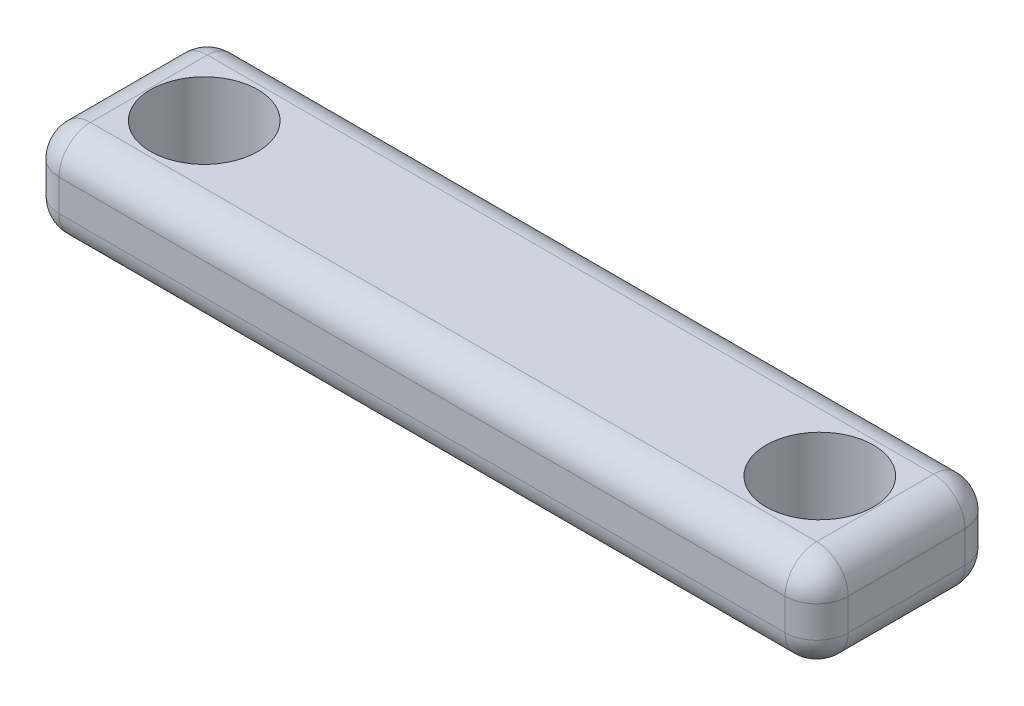
ISO-10303-21;
HEADER;
FILE_DESCRIPTION(('STEP AP214'),'2;1');
FILE_NAME('part.step','',(''),(''),'','','');
FILE_SCHEMA(('AUTOMOTIVE_DESIGN { 1 0 10303 214 1 1 1 1 }'));
ENDSEC;
DATA;
#1=APPLICATION_CONTEXT('core data for automotive mechanical design processes');
#2=APPLICATION_PROTOCOL_DEFINITION('international standard','automotive_design',2000,#1);
#3=PRODUCT_CONTEXT('',#1,'mechanical');
#4=PRODUCT('Part','Part','',(#3));
#5=PRODUCT_RELATED_PRODUCT_CATEGORY('part','',(#4));
#6=PRODUCT_DEFINITION_FORMATION('','',#4);
#7=PRODUCT_DEFINITION_CONTEXT('part definition',#1,'design');
#8=PRODUCT_DEFINITION('design','',#6,#7);
#9=PRODUCT_DEFINITION_SHAPE('','',#8);
#10=(LENGTH_UNIT() NAMED_UNIT(*) SI_UNIT(.MILLI.,.METRE.));
#11=(NAMED_UNIT(*) PLANE_ANGLE_UNIT() SI_UNIT($,.RADIAN.));
#12=(NAMED_UNIT(*) SI_UNIT($,.STERADIAN.) SOLID_ANGLE_UNIT());
#13=UNCERTAINTY_MEASURE_WITH_UNIT(LENGTH_MEASURE(1.E-05),#10,'distance_accuracy_value','');
#14=(GEOMETRIC_REPRESENTATION_CONTEXT(3) GLOBAL_UNCERTAINTY_ASSIGNED_CONTEXT((#13)) GLOBAL_UNIT_ASSIGNED_CONTEXT((#10,
#11,#12)) REPRESENTATION_CONTEXT('',''));
#15=CARTESIAN_POINT('',(0.,0.,0.));
#16=DIRECTION('',(0.,0.,1.));
#17=DIRECTION('',(1.,0.,0.));
#18=AXIS2_PLACEMENT_3D('',#15,#16,#17);
#19=CARTESIAN_POINT('',(0.,3.,0.));
#20=DIRECTION('',(0.,-1.,0.));
#21=DIRECTION('',(0.,0.,-1.));
#22=AXIS2_PLACEMENT_3D('',#19,#20,#21);
#23=PLANE('',#22);
#24=DIRECTION('',(0.,0.,-1.));
#25=VECTOR('',#24,1.);
#26=CARTESIAN_POINT('',(24.,3.,0.));
#27=LINE('',#26,#25);
#28=CARTESIAN_POINT('',(24.,3.,-1.));
#29=VERTEX_POINT('',#28);
#30=CARTESIAN_POINT('',(24.,3.,-4.7));
#31=VERTEX_POINT('',#30);
#32=EDGE_CURVE('E144',#29,#31,#27,.T.);
#33=ORIENTED_EDGE('',*,*,#32,.T.);
#34=DIRECTION('',(-1.,0.,0.));
#35=VECTOR('',#34,1.);
#36=CARTESIAN_POINT('',(0.,3.,-4.7));
#37=LINE('',#36,#35);
#38=CARTESIAN_POINT('',(1.,3.,-4.7));
#39=VERTEX_POINT('',#38);
#40=EDGE_CURVE('E139',#31,#39,#37,.T.);
#41=ORIENTED_EDGE('',*,*,#40,.T.);
#42=DIRECTION('',(0.,0.,1.));
#43=VECTOR('',#42,1.);
#44=CARTESIAN_POINT('',(1.,3.,0.));
#45=LINE('',#44,#43);
#46=CARTESIAN_POINT('',(1.,3.,-1.));
#47=VERTEX_POINT('',#46);
#48=EDGE_CURVE('E131',#39,#47,#45,.T.);
#49=ORIENTED_EDGE('',*,*,#48,.T.);
#50=DIRECTION('',(1.,0.,0.));
#51=VECTOR('',#50,1.);
#52=CARTESIAN_POINT('',(0.,3.,-1.));
#53=LINE('',#52,#51);
#54=EDGE_CURVE('E136',#47,#29,#53,.T.);
#55=ORIENTED_EDGE('',*,*,#54,.T.);
#56=EDGE_LOOP('',(#33,#41,#49,#55));
#57=FACE_BOUND('',#56,.T.);
#58=CARTESIAN_POINT('',(2.75,3.,-2.85));
#59=DIRECTION('',(0.,1.,0.));
#60=DIRECTION('',(0.,0.,1.));
#61=AXIS2_PLACEMENT_3D('',#58,#59,#60);
#62=CIRCLE('',#61,1.7);
#63=CARTESIAN_POINT('',(2.75,3.,-1.15));
#64=VERTEX_POINT('',#63);
#65=EDGE_CURVE('E173',#64,#64,#62,.T.);
#66=ORIENTED_EDGE('',*,*,#65,.F.);
#67=EDGE_LOOP('',(#66));
#68=FACE_BOUND('',#67,.T.);
#69=CARTESIAN_POINT('',(22.25,3.,-2.85));
#70=DIRECTION('',(0.,1.,0.));
#71=DIRECTION('',(0.,0.,1.));
#72=AXIS2_PLACEMENT_3D('',#69,#70,#71);
#73=CIRCLE('',#72,1.7);
#74=CARTESIAN_POINT('',(22.25,3.,-1.15));
#75=VERTEX_POINT('',#74);
#76=EDGE_CURVE('E327',#75,#75,#73,.T.);
#77=ORIENTED_EDGE('',*,*,#76,.F.);
#78=EDGE_LOOP('',(#77));
#79=FACE_BOUND('',#78,.T.);
#80=ADVANCED_FACE('F43',(#57,#68,#79),#23,.F.);
#81=CARTESIAN_POINT('',(0.,0.,0.));
#82=DIRECTION('',(0.,-1.,0.));
#83=DIRECTION('',(0.,0.,-1.));
#84=AXIS2_PLACEMENT_3D('',#81,#82,#83);
#85=PLANE('',#84);
#86=DIRECTION('',(0.,0.,1.));
#87=VECTOR('',#86,1.);
#88=CARTESIAN_POINT('',(1.,0.,-5.7));
#89=LINE('',#88,#87);
#90=CARTESIAN_POINT('',(1.,0.,-1.));
#91=VERTEX_POINT('',#90);
#92=CARTESIAN_POINT('',(1.,0.,-4.7));
#93=VERTEX_POINT('',#92);
#94=EDGE_CURVE('E202',#91,#93,#89,.F.);
#95=ORIENTED_EDGE('',*,*,#94,.T.);
#96=DIRECTION('',(-1.,0.,0.));
#97=VECTOR('',#96,1.);
#98=CARTESIAN_POINT('',(25.,0.,-4.7));
#99=LINE('',#98,#97);
#100=CARTESIAN_POINT('',(24.,0.,-4.7));
#101=VERTEX_POINT('',#100);
#102=EDGE_CURVE('E209',#93,#101,#99,.F.);
#103=ORIENTED_EDGE('',*,*,#102,.T.);
#104=DIRECTION('',(0.,0.,-1.));
#105=VECTOR('',#104,1.);
#106=CARTESIAN_POINT('',(24.,0.,0.));
#107=LINE('',#106,#105);
#108=CARTESIAN_POINT('',(24.,0.,-1.));
#109=VERTEX_POINT('',#108);
#110=EDGE_CURVE('E205',#101,#109,#107,.F.);
#111=ORIENTED_EDGE('',*,*,#110,.T.);
#112=DIRECTION('',(1.,0.,0.));
#113=VECTOR('',#112,1.);
#114=CARTESIAN_POINT('',(0.,0.,-1.));
#115=LINE('',#114,#113);
#116=EDGE_CURVE('E199',#109,#91,#115,.F.);
#117=ORIENTED_EDGE('',*,*,#116,.T.);
#118=EDGE_LOOP('',(#95,#103,#111,#117));
#119=FACE_BOUND('',#118,.T.);
#120=CARTESIAN_POINT('',(2.75,0.,-2.85));
#121=DIRECTION('',(0.,1.,0.));
#122=DIRECTION('',(0.,0.,1.));
#123=AXIS2_PLACEMENT_3D('',#120,#121,#122);
#124=CIRCLE('',#123,1.7);
#125=CARTESIAN_POINT('',(2.75,0.,-1.15));
#126=VERTEX_POINT('',#125);
#127=EDGE_CURVE('E178',#126,#126,#124,.T.);
#128=ORIENTED_EDGE('',*,*,#127,.T.);
#129=EDGE_LOOP('',(#128));
#130=FACE_BOUND('',#129,.T.);
#131=CARTESIAN_POINT('',(22.25,0.,-2.85));
#132=DIRECTION('',(0.,1.,0.));
#133=DIRECTION('',(0.,0.,1.));
#134=AXIS2_PLACEMENT_3D('',#131,#132,#133);
#135=CIRCLE('',#134,1.7);
#136=CARTESIAN_POINT('',(22.25,0.,-1.15));
#137=VERTEX_POINT('',#136);
#138=EDGE_CURVE('E319',#137,#137,#135,.T.);
#139=ORIENTED_EDGE('',*,*,#138,.T.);
#140=EDGE_LOOP('',(#139));
#141=FACE_BOUND('',#140,.T.);
#142=ADVANCED_FACE('F343',(#119,#130,#141),#85,.T.);
#143=CARTESIAN_POINT('',(0.,3.,0.));
#144=DIRECTION('',(1.,0.,0.));
#145=DIRECTION('',(0.,0.,-1.));
#146=AXIS2_PLACEMENT_3D('',#143,#144,#145);
#147=PLANE('',#146);
#148=DIRECTION('',(0.,0.,1.));
#149=VECTOR('',#148,1.);
#150=CARTESIAN_POINT('',(0.,2.,0.));
#151=LINE('',#150,#149);
#152=CARTESIAN_POINT('',(0.,2.,-1.));
#153=VERTEX_POINT('',#152);
#154=CARTESIAN_POINT('',(0.,2.,-4.7));
#155=VERTEX_POINT('',#154);
#156=EDGE_CURVE('E152',#153,#155,#151,.F.);
#157=ORIENTED_EDGE('',*,*,#156,.T.);
#158=DIRECTION('',(0.,-1.,0.));
#159=VECTOR('',#158,1.);
#160=CARTESIAN_POINT('',(0.,3.,-4.7));
#161=LINE('',#160,#159);
#162=CARTESIAN_POINT('',(0.,1.,-4.7));
#163=VERTEX_POINT('',#162);
#164=EDGE_CURVE('E220',#155,#163,#161,.T.);
#165=ORIENTED_EDGE('',*,*,#164,.T.);
#166=DIRECTION('',(0.,0.,1.));
#167=VECTOR('',#166,1.);
#168=CARTESIAN_POINT('',(0.,1.,0.));
#169=LINE('',#168,#167);
#170=CARTESIAN_POINT('',(0.,1.,-1.));
#171=VERTEX_POINT('',#170);
#172=EDGE_CURVE('E215',#163,#171,#169,.T.);
#173=ORIENTED_EDGE('',*,*,#172,.T.);
#174=DIRECTION('',(0.,-1.,0.));
#175=VECTOR('',#174,1.);
#176=CARTESIAN_POINT('',(0.,3.,-1.));
#177=LINE('',#176,#175);
#178=EDGE_CURVE('E212',#171,#153,#177,.F.);
#179=ORIENTED_EDGE('',*,*,#178,.T.);
#180=EDGE_LOOP('',(#157,#165,#173,#179));
#181=FACE_BOUND('',#180,.T.);
#182=ADVANCED_FACE('F364',(#181),#147,.F.);
#183=CARTESIAN_POINT('',(0.,3.,0.));
#184=DIRECTION('',(0.,0.,-1.));
#185=DIRECTION('',(-1.,0.,0.));
#186=AXIS2_PLACEMENT_3D('',#183,#184,#185);
#187=PLANE('',#186);
#188=DIRECTION('',(1.,0.,0.));
#189=VECTOR('',#188,1.);
#190=CARTESIAN_POINT('',(0.,2.,0.));
#191=LINE('',#190,#189);
#192=CARTESIAN_POINT('',(24.,2.,0.));
#193=VERTEX_POINT('',#192);
#194=CARTESIAN_POINT('',(1.,2.,0.));
#195=VERTEX_POINT('',#194);
#196=EDGE_CURVE('E53',#193,#195,#191,.F.);
#197=ORIENTED_EDGE('',*,*,#196,.T.);
#198=DIRECTION('',(0.,-1.,0.));
#199=VECTOR('',#198,1.);
#200=CARTESIAN_POINT('',(1.,3.,0.));
#201=LINE('',#200,#199);
#202=CARTESIAN_POINT('',(1.,1.,0.));
#203=VERTEX_POINT('',#202);
#204=EDGE_CURVE('E11',#195,#203,#201,.T.);
#205=ORIENTED_EDGE('',*,*,#204,.T.);
#206=DIRECTION('',(1.,0.,0.));
#207=VECTOR('',#206,1.);
#208=CARTESIAN_POINT('',(25.,1.,0.));
#209=LINE('',#208,#207);
#210=CARTESIAN_POINT('',(24.,1.,0.));
#211=VERTEX_POINT('',#210);
#212=EDGE_CURVE('E236',#203,#211,#209,.T.);
#213=ORIENTED_EDGE('',*,*,#212,.T.);
#214=DIRECTION('',(0.,-1.,0.));
#215=VECTOR('',#214,1.);
#216=CARTESIAN_POINT('',(24.,3.,0.));
#217=LINE('',#216,#215);
#218=EDGE_CURVE('E64',#211,#193,#217,.F.);
#219=ORIENTED_EDGE('',*,*,#218,.T.);
#220=EDGE_LOOP('',(#197,#205,#213,#219));
#221=FACE_BOUND('',#220,.T.);
#222=ADVANCED_FACE('F370',(#221),#187,.F.);
#223=CARTESIAN_POINT('',(25.,3.,0.));
#224=DIRECTION('',(-1.,0.,0.));
#225=DIRECTION('',(0.,0.,1.));
#226=AXIS2_PLACEMENT_3D('',#223,#224,#225);
#227=PLANE('',#226);
#228=DIRECTION('',(0.,0.,-1.));
#229=VECTOR('',#228,1.);
#230=CARTESIAN_POINT('',(25.,1.,-5.7));
#231=LINE('',#230,#229);
#232=CARTESIAN_POINT('',(25.,1.,-1.));
#233=VERTEX_POINT('',#232);
#234=CARTESIAN_POINT('',(25.,1.,-4.7));
#235=VERTEX_POINT('',#234);
#236=EDGE_CURVE('E189',#233,#235,#231,.T.);
#237=ORIENTED_EDGE('',*,*,#236,.T.);
#238=DIRECTION('',(0.,-1.,0.));
#239=VECTOR('',#238,1.);
#240=CARTESIAN_POINT('',(25.,3.,-4.7));
#241=LINE('',#240,#239);
#242=CARTESIAN_POINT('',(25.,2.,-4.7));
#243=VERTEX_POINT('',#242);
#244=EDGE_CURVE('E196',#235,#243,#241,.F.);
#245=ORIENTED_EDGE('',*,*,#244,.T.);
#246=DIRECTION('',(0.,0.,-1.));
#247=VECTOR('',#246,1.);
#248=CARTESIAN_POINT('',(25.,2.,0.));
#249=LINE('',#248,#247);
#250=CARTESIAN_POINT('',(25.,2.,-1.));
#251=VERTEX_POINT('',#250);
#252=EDGE_CURVE('E192',#243,#251,#249,.F.);
#253=ORIENTED_EDGE('',*,*,#252,.T.);
#254=DIRECTION('',(0.,-1.,0.));
#255=VECTOR('',#254,1.);
#256=CARTESIAN_POINT('',(25.,3.,-1.));
#257=LINE('',#256,#255);
#258=EDGE_CURVE('E186',#251,#233,#257,.T.);
#259=ORIENTED_EDGE('',*,*,#258,.T.);
#260=EDGE_LOOP('',(#237,#245,#253,#259));
#261=FACE_BOUND('',#260,.T.);
#262=ADVANCED_FACE('F356',(#261),#227,.F.);
#263=CARTESIAN_POINT('',(0.,3.,-5.7));
#264=DIRECTION('',(0.,0.,1.));
#265=DIRECTION('',(1.,0.,0.));
#266=AXIS2_PLACEMENT_3D('',#263,#264,#265);
#267=PLANE('',#266);
#268=DIRECTION('',(-1.,0.,0.));
#269=VECTOR('',#268,1.);
#270=CARTESIAN_POINT('',(0.,2.,-5.7));
#271=LINE('',#270,#269);
#272=CARTESIAN_POINT('',(1.,2.,-5.7));
#273=VERTEX_POINT('',#272);
#274=CARTESIAN_POINT('',(24.,2.,-5.7));
#275=VERTEX_POINT('',#274);
#276=EDGE_CURVE('E229',#273,#275,#271,.F.);
#277=ORIENTED_EDGE('',*,*,#276,.T.);
#278=DIRECTION('',(0.,-1.,0.));
#279=VECTOR('',#278,1.);
#280=CARTESIAN_POINT('',(24.,3.,-5.7));
#281=LINE('',#280,#279);
#282=CARTESIAN_POINT('',(24.,1.,-5.7));
#283=VERTEX_POINT('',#282);
#284=EDGE_CURVE('E232',#275,#283,#281,.T.);
#285=ORIENTED_EDGE('',*,*,#284,.T.);
#286=DIRECTION('',(-1.,0.,0.));
#287=VECTOR('',#286,1.);
#288=CARTESIAN_POINT('',(0.,1.,-5.7));
#289=LINE('',#288,#287);
#290=CARTESIAN_POINT('',(1.,1.,-5.7));
#291=VERTEX_POINT('',#290);
#292=EDGE_CURVE('E223',#283,#291,#289,.T.);
#293=ORIENTED_EDGE('',*,*,#292,.T.);
#294=DIRECTION('',(0.,-1.,0.));
#295=VECTOR('',#294,1.);
#296=CARTESIAN_POINT('',(1.,3.,-5.7));
#297=LINE('',#296,#295);
#298=EDGE_CURVE('E226',#291,#273,#297,.F.);
#299=ORIENTED_EDGE('',*,*,#298,.T.);
#300=EDGE_LOOP('',(#277,#285,#293,#299));
#301=FACE_BOUND('',#300,.T.);
#302=ADVANCED_FACE('F348',(#301),#267,.F.);
#303=CARTESIAN_POINT('',(2.75,3.,-2.85));
#304=DIRECTION('',(0.,-1.,0.));
#305=DIRECTION('',(0.,0.,-1.));
#306=AXIS2_PLACEMENT_3D('',#303,#304,#305);
#307=CYLINDRICAL_SURFACE('',#306,1.7);
#308=ORIENTED_EDGE('',*,*,#65,.T.);
#309=EDGE_LOOP('',(#308));
#310=FACE_BOUND('',#309,.T.);
#311=ORIENTED_EDGE('',*,*,#127,.F.);
#312=EDGE_LOOP('',(#311));
#313=FACE_BOUND('',#312,.T.);
#314=ADVANCED_FACE('F345',(#310,#313),#307,.F.);
#315=CARTESIAN_POINT('',(22.25,3.,-2.85));
#316=DIRECTION('',(0.,-1.,0.));
#317=DIRECTION('',(0.,0.,-1.));
#318=AXIS2_PLACEMENT_3D('',#315,#316,#317);
#319=CYLINDRICAL_SURFACE('',#318,1.7);
#320=ORIENTED_EDGE('',*,*,#76,.T.);
#321=EDGE_LOOP('',(#320));
#322=FACE_BOUND('',#321,.T.);
#323=ORIENTED_EDGE('',*,*,#138,.F.);
#324=EDGE_LOOP('',(#323));
#325=FACE_BOUND('',#324,.T.);
#326=ADVANCED_FACE('F347',(#322,#325),#319,.F.);
#327=CARTESIAN_POINT('',(1.,1.,0.));
#328=DIRECTION('',(0.,0.,-1.));
#329=DIRECTION('',(-1.,0.,0.));
#330=AXIS2_PLACEMENT_3D('',#327,#328,#329);
#331=CYLINDRICAL_SURFACE('',#330,1.);
#332=CARTESIAN_POINT('',(1.,1.,-1.));
#333=DIRECTION('',(0.,0.,1.));
#334=DIRECTION('',(1.,0.,0.));
#335=AXIS2_PLACEMENT_3D('',#332,#333,#334);
#336=CIRCLE('',#335,1.);
#337=EDGE_CURVE('E47',#171,#91,#336,.T.);
#338=ORIENTED_EDGE('',*,*,#337,.F.);
#339=ORIENTED_EDGE('',*,*,#172,.F.);
#340=CARTESIAN_POINT('',(1.,1.,-4.7));
#341=DIRECTION('',(0.,0.,-1.));
#342=DIRECTION('',(-1.,0.,0.));
#343=AXIS2_PLACEMENT_3D('',#340,#341,#342);
#344=CIRCLE('',#343,1.);
#345=EDGE_CURVE('E309',#93,#163,#344,.T.);
#346=ORIENTED_EDGE('',*,*,#345,.F.);
#347=ORIENTED_EDGE('',*,*,#94,.F.);
#348=EDGE_LOOP('',(#338,#339,#346,#347));
#349=FACE_BOUND('',#348,.T.);
#350=ADVANCED_FACE('F45',(#349),#331,.T.);
#351=CARTESIAN_POINT('',(1.,1.,-1.));
#352=DIRECTION('',(0.,-1.,0.));
#353=DIRECTION('',(0.,0.,-1.));
#354=AXIS2_PLACEMENT_3D('',#351,#352,#353);
#355=SPHERICAL_SURFACE('',#354,1.);
#356=CARTESIAN_POINT('',(1.,1.,-1.));
#357=DIRECTION('',(0.,-1.,0.));
#358=DIRECTION('',(0.,0.,-1.));
#359=AXIS2_PLACEMENT_3D('',#356,#357,#358);
#360=CIRCLE('',#359,1.);
#361=EDGE_CURVE('E302',#171,#203,#360,.F.);
#362=ORIENTED_EDGE('',*,*,#361,.F.);
#363=ORIENTED_EDGE('',*,*,#337,.T.);
#364=CARTESIAN_POINT('',(1.,1.,-1.));
#365=DIRECTION('',(-1.,0.,0.));
#366=DIRECTION('',(0.,0.,1.));
#367=AXIS2_PLACEMENT_3D('',#364,#365,#366);
#368=CIRCLE('',#367,1.);
#369=EDGE_CURVE('E306',#203,#91,#368,.F.);
#370=ORIENTED_EDGE('',*,*,#369,.F.);
#371=EDGE_LOOP('',(#362,#363,#370));
#372=FACE_BOUND('',#371,.T.);
#373=ADVANCED_FACE('F441',(#372),#355,.T.);
#374=CARTESIAN_POINT('',(1.,1.,-4.7));
#375=DIRECTION('',(-1.,0.,0.));
#376=DIRECTION('',(0.,0.,1.));
#377=AXIS2_PLACEMENT_3D('',#374,#375,#376);
#378=SPHERICAL_SURFACE('',#377,1.);
#379=CARTESIAN_POINT('',(1.,1.,-4.7));
#380=DIRECTION('',(-1.,0.,0.));
#381=DIRECTION('',(0.,0.,1.));
#382=AXIS2_PLACEMENT_3D('',#379,#380,#381);
#383=CIRCLE('',#382,1.);
#384=EDGE_CURVE('E294',#93,#291,#383,.F.);
#385=ORIENTED_EDGE('',*,*,#384,.F.);
#386=ORIENTED_EDGE('',*,*,#345,.T.);
#387=CARTESIAN_POINT('',(1.,1.,-4.7));
#388=DIRECTION('',(0.,-1.,0.));
#389=DIRECTION('',(0.,0.,-1.));
#390=AXIS2_PLACEMENT_3D('',#387,#388,#389);
#391=CIRCLE('',#390,1.);
#392=EDGE_CURVE('E298',#291,#163,#391,.F.);
#393=ORIENTED_EDGE('',*,*,#392,.F.);
#394=EDGE_LOOP('',(#385,#386,#393));
#395=FACE_BOUND('',#394,.T.);
#396=ADVANCED_FACE('F438',(#395),#378,.T.);
#397=CARTESIAN_POINT('',(0.,1.,-1.));
#398=DIRECTION('',(-1.,0.,0.));
#399=DIRECTION('',(0.,0.,1.));
#400=AXIS2_PLACEMENT_3D('',#397,#398,#399);
#401=CYLINDRICAL_SURFACE('',#400,1.);
#402=ORIENTED_EDGE('',*,*,#369,.T.);
#403=ORIENTED_EDGE('',*,*,#116,.F.);
#404=CARTESIAN_POINT('',(24.,1.,-1.));
#405=DIRECTION('',(1.,0.,0.));
#406=DIRECTION('',(0.,0.,-1.));
#407=AXIS2_PLACEMENT_3D('',#404,#405,#406);
#408=CIRCLE('',#407,1.);
#409=EDGE_CURVE('E287',#211,#109,#408,.T.);
#410=ORIENTED_EDGE('',*,*,#409,.F.);
#411=ORIENTED_EDGE('',*,*,#212,.F.);
#412=EDGE_LOOP('',(#402,#403,#410,#411));
#413=FACE_BOUND('',#412,.T.);
#414=ADVANCED_FACE('F434',(#413),#401,.T.);
#415=CARTESIAN_POINT('',(1.,3.,-1.));
#416=DIRECTION('',(0.,-1.,0.));
#417=DIRECTION('',(0.,0.,-1.));
#418=AXIS2_PLACEMENT_3D('',#415,#416,#417);
#419=CYLINDRICAL_SURFACE('',#418,1.);
#420=ORIENTED_EDGE('',*,*,#361,.T.);
#421=ORIENTED_EDGE('',*,*,#204,.F.);
#422=CARTESIAN_POINT('',(1.,2.,-1.));
#423=DIRECTION('',(0.,1.,0.));
#424=DIRECTION('',(0.,0.,1.));
#425=AXIS2_PLACEMENT_3D('',#422,#423,#424);
#426=CIRCLE('',#425,1.);
#427=EDGE_CURVE('E157',#153,#195,#426,.T.);
#428=ORIENTED_EDGE('',*,*,#427,.F.);
#429=ORIENTED_EDGE('',*,*,#178,.F.);
#430=EDGE_LOOP('',(#420,#421,#428,#429));
#431=FACE_BOUND('',#430,.T.);
#432=ADVANCED_FACE('F431',(#431),#419,.T.);
#433=CARTESIAN_POINT('',(1.,2.,0.));
#434=DIRECTION('',(0.,0.,1.));
#435=DIRECTION('',(1.,0.,0.));
#436=AXIS2_PLACEMENT_3D('',#433,#434,#435);
#437=CYLINDRICAL_SURFACE('',#436,1.);
#438=CARTESIAN_POINT('',(1.,2.,-4.7));
#439=DIRECTION('',(0.,0.,-1.));
#440=DIRECTION('',(-1.,0.,0.));
#441=AXIS2_PLACEMENT_3D('',#438,#439,#440);
#442=CIRCLE('',#441,1.);
#443=EDGE_CURVE('E158',#155,#39,#442,.T.);
#444=ORIENTED_EDGE('',*,*,#443,.F.);
#445=ORIENTED_EDGE('',*,*,#156,.F.);
#446=CARTESIAN_POINT('',(1.,2.,-1.));
#447=DIRECTION('',(0.,0.,1.));
#448=DIRECTION('',(1.,0.,0.));
#449=AXIS2_PLACEMENT_3D('',#446,#447,#448);
#450=CIRCLE('',#449,1.);
#451=EDGE_CURVE('E148',#47,#153,#450,.T.);
#452=ORIENTED_EDGE('',*,*,#451,.F.);
#453=ORIENTED_EDGE('',*,*,#48,.F.);
#454=EDGE_LOOP('',(#444,#445,#452,#453));
#455=FACE_BOUND('',#454,.T.);
#456=ADVANCED_FACE('F150',(#455),#437,.T.);
#457=CARTESIAN_POINT('',(1.,3.,-4.7));
#458=DIRECTION('',(0.,-1.,0.));
#459=DIRECTION('',(0.,0.,-1.));
#460=AXIS2_PLACEMENT_3D('',#457,#458,#459);
#461=CYLINDRICAL_SURFACE('',#460,1.);
#462=ORIENTED_EDGE('',*,*,#392,.T.);
#463=ORIENTED_EDGE('',*,*,#164,.F.);
#464=CARTESIAN_POINT('',(1.,2.,-4.7));
#465=DIRECTION('',(0.,1.,0.));
#466=DIRECTION('',(0.,0.,1.));
#467=AXIS2_PLACEMENT_3D('',#464,#465,#466);
#468=CIRCLE('',#467,1.);
#469=EDGE_CURVE('E280',#273,#155,#468,.T.);
#470=ORIENTED_EDGE('',*,*,#469,.F.);
#471=ORIENTED_EDGE('',*,*,#298,.F.);
#472=EDGE_LOOP('',(#462,#463,#470,#471));
#473=FACE_BOUND('',#472,.T.);
#474=ADVANCED_FACE('F424',(#473),#461,.T.);
#475=CARTESIAN_POINT('',(0.,1.,-4.7));
#476=DIRECTION('',(1.,0.,0.));
#477=DIRECTION('',(0.,0.,-1.));
#478=AXIS2_PLACEMENT_3D('',#475,#476,#477);
#479=CYLINDRICAL_SURFACE('',#478,1.);
#480=ORIENTED_EDGE('',*,*,#384,.T.);
#481=ORIENTED_EDGE('',*,*,#292,.F.);
#482=CARTESIAN_POINT('',(24.,1.,-4.7));
#483=DIRECTION('',(1.,0.,0.));
#484=DIRECTION('',(0.,0.,-1.));
#485=AXIS2_PLACEMENT_3D('',#482,#483,#484);
#486=CIRCLE('',#485,1.);
#487=EDGE_CURVE('E276',#101,#283,#486,.T.);
#488=ORIENTED_EDGE('',*,*,#487,.F.);
#489=ORIENTED_EDGE('',*,*,#102,.F.);
#490=EDGE_LOOP('',(#480,#481,#488,#489));
#491=FACE_BOUND('',#490,.T.);
#492=ADVANCED_FACE('F420',(#491),#479,.T.);
#493=CARTESIAN_POINT('',(24.,1.,0.));
#494=DIRECTION('',(0.,0.,1.));
#495=DIRECTION('',(1.,0.,0.));
#496=AXIS2_PLACEMENT_3D('',#493,#494,#495);
#497=CYLINDRICAL_SURFACE('',#496,1.);
#498=CARTESIAN_POINT('',(24.,1.,-1.));
#499=DIRECTION('',(0.,0.,1.));
#500=DIRECTION('',(1.,0.,0.));
#501=AXIS2_PLACEMENT_3D('',#498,#499,#500);
#502=CIRCLE('',#501,1.);
#503=EDGE_CURVE('E290',#109,#233,#502,.T.);
#504=ORIENTED_EDGE('',*,*,#503,.F.);
#505=ORIENTED_EDGE('',*,*,#110,.F.);
#506=CARTESIAN_POINT('',(24.,1.,-4.7));
#507=DIRECTION('',(0.,0.,-1.));
#508=DIRECTION('',(-1.,0.,0.));
#509=AXIS2_PLACEMENT_3D('',#506,#507,#508);
#510=CIRCLE('',#509,1.);
#511=EDGE_CURVE('E272',#235,#101,#510,.T.);
#512=ORIENTED_EDGE('',*,*,#511,.F.);
#513=ORIENTED_EDGE('',*,*,#236,.F.);
#514=EDGE_LOOP('',(#504,#505,#512,#513));
#515=FACE_BOUND('',#514,.T.);
#516=ADVANCED_FACE('F416',(#515),#497,.T.);
#517=CARTESIAN_POINT('',(24.,1.,-1.));
#518=DIRECTION('',(0.,-1.,0.));
#519=DIRECTION('',(0.,0.,-1.));
#520=AXIS2_PLACEMENT_3D('',#517,#518,#519);
#521=SPHERICAL_SURFACE('',#520,1.);
#522=ORIENTED_EDGE('',*,*,#409,.T.);
#523=ORIENTED_EDGE('',*,*,#503,.T.);
#524=CARTESIAN_POINT('',(24.,1.,-1.));
#525=DIRECTION('',(0.,-1.,0.));
#526=DIRECTION('',(0.,0.,-1.));
#527=AXIS2_PLACEMENT_3D('',#524,#525,#526);
#528=CIRCLE('',#527,1.);
#529=EDGE_CURVE('E165',#211,#233,#528,.F.);
#530=ORIENTED_EDGE('',*,*,#529,.F.);
#531=EDGE_LOOP('',(#522,#523,#530));
#532=FACE_BOUND('',#531,.T.);
#533=ADVANCED_FACE('F413',(#532),#521,.T.);
#534=CARTESIAN_POINT('',(1.,2.,-1.));
#535=DIRECTION('',(-1.,0.,0.));
#536=DIRECTION('',(0.,0.,1.));
#537=AXIS2_PLACEMENT_3D('',#534,#535,#536);
#538=SPHERICAL_SURFACE('',#537,1.);
#539=ORIENTED_EDGE('',*,*,#451,.T.);
#540=ORIENTED_EDGE('',*,*,#427,.T.);
#541=CARTESIAN_POINT('',(1.,2.,-1.));
#542=DIRECTION('',(-1.,0.,0.));
#543=DIRECTION('',(0.,0.,1.));
#544=AXIS2_PLACEMENT_3D('',#541,#542,#543);
#545=CIRCLE('',#544,1.);
#546=EDGE_CURVE('E161',#47,#195,#545,.F.);
#547=ORIENTED_EDGE('',*,*,#546,.F.);
#548=EDGE_LOOP('',(#539,#540,#547));
#549=FACE_BOUND('',#548,.T.);
#550=ADVANCED_FACE('F162',(#549),#538,.T.);
#551=CARTESIAN_POINT('',(1.,2.,-4.7));
#552=DIRECTION('',(-1.,0.,0.));
#553=DIRECTION('',(0.,0.,1.));
#554=AXIS2_PLACEMENT_3D('',#551,#552,#553);
#555=SPHERICAL_SURFACE('',#554,1.);
#556=ORIENTED_EDGE('',*,*,#469,.T.);
#557=ORIENTED_EDGE('',*,*,#443,.T.);
#558=CARTESIAN_POINT('',(1.,2.,-4.7));
#559=DIRECTION('',(-1.,0.,0.));
#560=DIRECTION('',(0.,0.,1.));
#561=AXIS2_PLACEMENT_3D('',#558,#559,#560);
#562=CIRCLE('',#561,1.);
#563=EDGE_CURVE('E166',#273,#39,#562,.F.);
#564=ORIENTED_EDGE('',*,*,#563,.F.);
#565=EDGE_LOOP('',(#556,#557,#564));
#566=FACE_BOUND('',#565,.T.);
#567=ADVANCED_FACE('F406',(#566),#555,.T.);
#568=CARTESIAN_POINT('',(24.,1.,-4.7));
#569=DIRECTION('',(0.,-1.,0.));
#570=DIRECTION('',(0.,0.,-1.));
#571=AXIS2_PLACEMENT_3D('',#568,#569,#570);
#572=SPHERICAL_SURFACE('',#571,1.);
#573=ORIENTED_EDGE('',*,*,#511,.T.);
#574=ORIENTED_EDGE('',*,*,#487,.T.);
#575=CARTESIAN_POINT('',(24.,1.,-4.7));
#576=DIRECTION('',(0.,-1.,0.));
#577=DIRECTION('',(0.,0.,-1.));
#578=AXIS2_PLACEMENT_3D('',#575,#576,#577);
#579=CIRCLE('',#578,1.);
#580=EDGE_CURVE('E263',#235,#283,#579,.F.);
#581=ORIENTED_EDGE('',*,*,#580,.F.);
#582=EDGE_LOOP('',(#573,#574,#581));
#583=FACE_BOUND('',#582,.T.);
#584=ADVANCED_FACE('F402',(#583),#572,.T.);
#585=CARTESIAN_POINT('',(24.,3.,-1.));
#586=DIRECTION('',(0.,-1.,0.));
#587=DIRECTION('',(0.,0.,-1.));
#588=AXIS2_PLACEMENT_3D('',#585,#586,#587);
#589=CYLINDRICAL_SURFACE('',#588,1.);
#590=ORIENTED_EDGE('',*,*,#529,.T.);
#591=ORIENTED_EDGE('',*,*,#258,.F.);
#592=CARTESIAN_POINT('',(24.,2.,-1.));
#593=DIRECTION('',(0.,1.,0.));
#594=DIRECTION('',(0.,0.,1.));
#595=AXIS2_PLACEMENT_3D('',#592,#593,#594);
#596=CIRCLE('',#595,1.);
#597=EDGE_CURVE('E259',#193,#251,#596,.T.);
#598=ORIENTED_EDGE('',*,*,#597,.F.);
#599=ORIENTED_EDGE('',*,*,#218,.F.);
#600=EDGE_LOOP('',(#590,#591,#598,#599));
#601=FACE_BOUND('',#600,.T.);
#602=ADVANCED_FACE('F399',(#601),#589,.T.);
#603=CARTESIAN_POINT('',(0.,2.,-1.));
#604=DIRECTION('',(1.,0.,0.));
#605=DIRECTION('',(0.,0.,-1.));
#606=AXIS2_PLACEMENT_3D('',#603,#604,#605);
#607=CYLINDRICAL_SURFACE('',#606,1.);
#608=ORIENTED_EDGE('',*,*,#546,.T.);
#609=ORIENTED_EDGE('',*,*,#196,.F.);
#610=CARTESIAN_POINT('',(24.,2.,-1.));
#611=DIRECTION('',(1.,0.,0.));
#612=DIRECTION('',(0.,0.,-1.));
#613=AXIS2_PLACEMENT_3D('',#610,#611,#612);
#614=CIRCLE('',#613,1.);
#615=EDGE_CURVE('E170',#29,#193,#614,.T.);
#616=ORIENTED_EDGE('',*,*,#615,.F.);
#617=ORIENTED_EDGE('',*,*,#54,.F.);
#618=EDGE_LOOP('',(#608,#609,#616,#617));
#619=FACE_BOUND('',#618,.T.);
#620=ADVANCED_FACE('F168',(#619),#607,.T.);
#621=CARTESIAN_POINT('',(0.,2.,-4.7));
#622=DIRECTION('',(-1.,0.,0.));
#623=DIRECTION('',(0.,0.,1.));
#624=AXIS2_PLACEMENT_3D('',#621,#622,#623);
#625=CYLINDRICAL_SURFACE('',#624,1.);
#626=ORIENTED_EDGE('',*,*,#563,.T.);
#627=ORIENTED_EDGE('',*,*,#40,.F.);
#628=CARTESIAN_POINT('',(24.,2.,-4.7));
#629=DIRECTION('',(1.,0.,0.));
#630=DIRECTION('',(0.,0.,-1.));
#631=AXIS2_PLACEMENT_3D('',#628,#629,#630);
#632=CIRCLE('',#631,1.);
#633=EDGE_CURVE('E253',#275,#31,#632,.T.);
#634=ORIENTED_EDGE('',*,*,#633,.F.);
#635=ORIENTED_EDGE('',*,*,#276,.F.);
#636=EDGE_LOOP('',(#626,#627,#634,#635));
#637=FACE_BOUND('',#636,.T.);
#638=ADVANCED_FACE('F392',(#637),#625,.T.);
#639=CARTESIAN_POINT('',(24.,3.,-4.7));
#640=DIRECTION('',(0.,-1.,0.));
#641=DIRECTION('',(0.,0.,-1.));
#642=AXIS2_PLACEMENT_3D('',#639,#640,#641);
#643=CYLINDRICAL_SURFACE('',#642,1.);
#644=ORIENTED_EDGE('',*,*,#580,.T.);
#645=ORIENTED_EDGE('',*,*,#284,.F.);
#646=CARTESIAN_POINT('',(24.,2.,-4.7));
#647=DIRECTION('',(0.,1.,0.));
#648=DIRECTION('',(0.,0.,1.));
#649=AXIS2_PLACEMENT_3D('',#646,#647,#648);
#650=CIRCLE('',#649,1.);
#651=EDGE_CURVE('E249',#243,#275,#650,.T.);
#652=ORIENTED_EDGE('',*,*,#651,.F.);
#653=ORIENTED_EDGE('',*,*,#244,.F.);
#654=EDGE_LOOP('',(#644,#645,#652,#653));
#655=FACE_BOUND('',#654,.T.);
#656=ADVANCED_FACE('F388',(#655),#643,.T.);
#657=CARTESIAN_POINT('',(24.,2.,-1.));
#658=DIRECTION('',(0.,0.,1.));
#659=DIRECTION('',(1.,0.,0.));
#660=AXIS2_PLACEMENT_3D('',#657,#658,#659);
#661=SPHERICAL_SURFACE('',#660,1.);
#662=ORIENTED_EDGE('',*,*,#615,.T.);
#663=ORIENTED_EDGE('',*,*,#597,.T.);
#664=CARTESIAN_POINT('',(24.,2.,-1.));
#665=DIRECTION('',(0.,0.,1.));
#666=DIRECTION('',(1.,0.,0.));
#667=AXIS2_PLACEMENT_3D('',#664,#665,#666);
#668=CIRCLE('',#667,1.);
#669=EDGE_CURVE('E246',#29,#251,#668,.F.);
#670=ORIENTED_EDGE('',*,*,#669,.F.);
#671=EDGE_LOOP('',(#662,#663,#670));
#672=FACE_BOUND('',#671,.T.);
#673=ADVANCED_FACE('F384',(#672),#661,.T.);
#674=CARTESIAN_POINT('',(24.,2.,-4.7));
#675=DIRECTION('',(0.,0.,-1.));
#676=DIRECTION('',(-1.,0.,0.));
#677=AXIS2_PLACEMENT_3D('',#674,#675,#676);
#678=SPHERICAL_SURFACE('',#677,1.);
#679=ORIENTED_EDGE('',*,*,#651,.T.);
#680=ORIENTED_EDGE('',*,*,#633,.T.);
#681=CARTESIAN_POINT('',(24.,2.,-4.7));
#682=DIRECTION('',(0.,0.,-1.));
#683=DIRECTION('',(-1.,0.,0.));
#684=AXIS2_PLACEMENT_3D('',#681,#682,#683);
#685=CIRCLE('',#684,1.);
#686=EDGE_CURVE('E243',#243,#31,#685,.F.);
#687=ORIENTED_EDGE('',*,*,#686,.F.);
#688=EDGE_LOOP('',(#679,#680,#687));
#689=FACE_BOUND('',#688,.T.);
#690=ADVANCED_FACE('F380',(#689),#678,.T.);
#691=CARTESIAN_POINT('',(24.,2.,0.));
#692=DIRECTION('',(0.,0.,-1.));
#693=DIRECTION('',(-1.,0.,0.));
#694=AXIS2_PLACEMENT_3D('',#691,#692,#693);
#695=CYLINDRICAL_SURFACE('',#694,1.);
#696=ORIENTED_EDGE('',*,*,#669,.T.);
#697=ORIENTED_EDGE('',*,*,#252,.F.);
#698=ORIENTED_EDGE('',*,*,#686,.T.);
#699=ORIENTED_EDGE('',*,*,#32,.F.);
#700=EDGE_LOOP('',(#696,#697,#698,#699));
#701=FACE_BOUND('',#700,.T.);
#702=ADVANCED_FACE('F377',(#701),#695,.T.);
#703=CLOSED_SHELL('',(#80,#142,#182,#222,#262,#302,#314,#326,#350,#373,#396,#414,#432,#456,#474,
#492,#516,#533,#550,#567,#584,#602,#620,#638,#656,#673,#690,#702));
#704=MANIFOLD_SOLID_BREP('B2',#703);
#705=ADVANCED_BREP_SHAPE_REPRESENTATION('',(#18,#704),#14);
#706=SHAPE_DEFINITION_REPRESENTATION(#9,#705);
ENDSEC;
END-ISO-10303-21;
